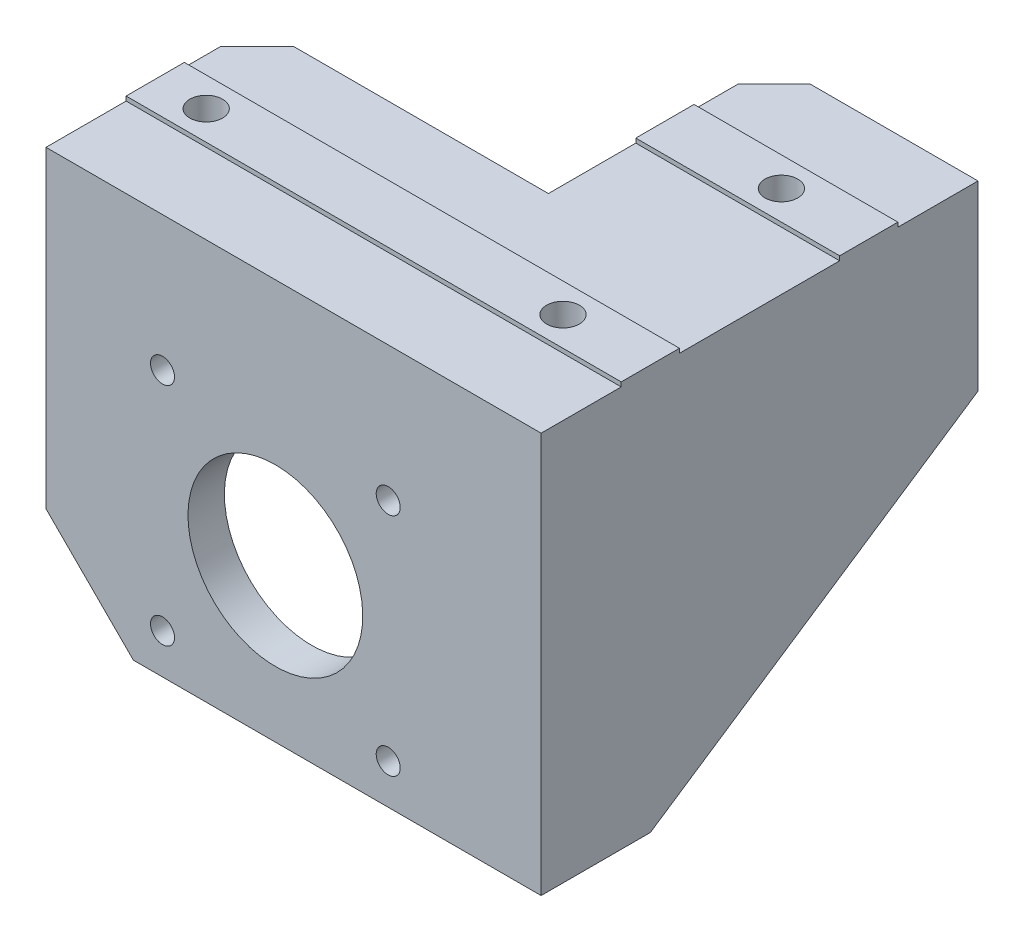
ISO-10303-21;
HEADER;
FILE_DESCRIPTION(('STEP AP214'),'2;1');
FILE_NAME('part.step','',(''),(''),'','','');
FILE_SCHEMA(('AUTOMOTIVE_DESIGN { 1 0 10303 214 1 1 1 1 }'));
ENDSEC;
DATA;
#1=APPLICATION_CONTEXT('core data for automotive mechanical design processes');
#2=APPLICATION_PROTOCOL_DEFINITION('international standard','automotive_design',2000,#1);
#3=PRODUCT_CONTEXT('',#1,'mechanical');
#4=PRODUCT('Part','Part','',(#3));
#5=PRODUCT_RELATED_PRODUCT_CATEGORY('part','',(#4));
#6=PRODUCT_DEFINITION_FORMATION('','',#4);
#7=PRODUCT_DEFINITION_CONTEXT('part definition',#1,'design');
#8=PRODUCT_DEFINITION('design','',#6,#7);
#9=PRODUCT_DEFINITION_SHAPE('','',#8);
#10=(LENGTH_UNIT() NAMED_UNIT(*) SI_UNIT(.MILLI.,.METRE.));
#11=(NAMED_UNIT(*) PLANE_ANGLE_UNIT() SI_UNIT($,.RADIAN.));
#12=(NAMED_UNIT(*) SI_UNIT($,.STERADIAN.) SOLID_ANGLE_UNIT());
#13=UNCERTAINTY_MEASURE_WITH_UNIT(LENGTH_MEASURE(1.E-05),#10,'distance_accuracy_value','');
#14=(GEOMETRIC_REPRESENTATION_CONTEXT(3) GLOBAL_UNCERTAINTY_ASSIGNED_CONTEXT((#13)) GLOBAL_UNIT_ASSIGNED_CONTEXT((#10,
#11,#12)) REPRESENTATION_CONTEXT('',''));
#15=CARTESIAN_POINT('',(0.,0.,0.));
#16=DIRECTION('',(0.,0.,1.));
#17=DIRECTION('',(1.,0.,0.));
#18=AXIS2_PLACEMENT_3D('',#15,#16,#17);
#19=CARTESIAN_POINT('',(31.5,12.,0.));
#20=DIRECTION('',(0.,-1.,0.));
#21=DIRECTION('',(0.,0.,-1.));
#22=AXIS2_PLACEMENT_3D('',#19,#20,#21);
#23=PLANE('',#22);
#24=DIRECTION('',(-1.,0.,0.));
#25=VECTOR('',#24,1.);
#26=CARTESIAN_POINT('',(31.5,12.,0.));
#27=LINE('',#26,#25);
#28=CARTESIAN_POINT('',(36.5,12.,0.));
#29=VERTEX_POINT('',#28);
#30=CARTESIAN_POINT('',(13.5,12.,0.));
#31=VERTEX_POINT('',#30);
#32=EDGE_CURVE('E471',#29,#31,#27,.T.);
#33=ORIENTED_EDGE('',*,*,#32,.T.);
#34=DIRECTION('',(0.707106781186548,0.,-0.707106781186547));
#35=VECTOR('',#34,1.);
#36=CARTESIAN_POINT('',(8.5,12.,4.99999999999998));
#37=LINE('',#36,#35);
#38=CARTESIAN_POINT('',(8.5,12.,4.99999999999998));
#39=VERTEX_POINT('',#38);
#40=EDGE_CURVE('E11',#31,#39,#37,.F.);
#41=ORIENTED_EDGE('',*,*,#40,.T.);
#42=DIRECTION('',(0.,0.,1.));
#43=VECTOR('',#42,1.);
#44=CARTESIAN_POINT('',(8.5,12.,0.));
#45=LINE('',#44,#43);
#46=CARTESIAN_POINT('',(8.5,12.,11.));
#47=VERTEX_POINT('',#46);
#48=EDGE_CURVE('E307',#39,#47,#45,.T.);
#49=ORIENTED_EDGE('',*,*,#48,.T.);
#50=DIRECTION('',(-1.,0.,0.));
#51=VECTOR('',#50,1.);
#52=CARTESIAN_POINT('',(36.5,12.,11.));
#53=LINE('',#52,#51);
#54=CARTESIAN_POINT('',(36.5,12.,11.));
#55=VERTEX_POINT('',#54);
#56=EDGE_CURVE('E431',#55,#47,#53,.T.);
#57=ORIENTED_EDGE('',*,*,#56,.F.);
#58=DIRECTION('',(0.,0.,1.));
#59=VECTOR('',#58,1.);
#60=CARTESIAN_POINT('',(36.5,12.,0.));
#61=LINE('',#60,#59);
#62=EDGE_CURVE('E202',#29,#55,#61,.T.);
#63=ORIENTED_EDGE('',*,*,#62,.F.);
#64=EDGE_LOOP('',(#33,#41,#49,#57,#63));
#65=FACE_BOUND('',#64,.T.);
#66=ADVANCED_FACE('F35',(#65),#23,.F.);
#67=DIRECTION('',(-1.,0.,0.));
#68=VECTOR('',#67,1.);
#69=CARTESIAN_POINT('',(-31.5,12.,31.));
#70=LINE('',#69,#68);
#71=CARTESIAN_POINT('',(8.5,12.,31.));
#72=VERTEX_POINT('',#71);
#73=CARTESIAN_POINT('',(-26.5,12.,31.));
#74=VERTEX_POINT('',#73);
#75=EDGE_CURVE('E322',#72,#74,#70,.T.);
#76=ORIENTED_EDGE('',*,*,#75,.T.);
#77=DIRECTION('',(-0.707106781186549,0.,0.707106781186547));
#78=VECTOR('',#77,1.);
#79=CARTESIAN_POINT('',(-31.5,12.,36.));
#80=LINE('',#79,#78);
#81=CARTESIAN_POINT('',(-31.5,12.,36.));
#82=VERTEX_POINT('',#81);
#83=EDGE_CURVE('E296',#74,#82,#80,.T.);
#84=ORIENTED_EDGE('',*,*,#83,.T.);
#85=DIRECTION('',(0.,0.,1.));
#86=VECTOR('',#85,1.);
#87=CARTESIAN_POINT('',(-31.5,12.,0.));
#88=LINE('',#87,#86);
#89=CARTESIAN_POINT('',(-31.5,12.,41.));
#90=VERTEX_POINT('',#89);
#91=EDGE_CURVE('E271',#82,#90,#88,.T.);
#92=ORIENTED_EDGE('',*,*,#91,.T.);
#93=DIRECTION('',(-1.,0.,0.));
#94=VECTOR('',#93,1.);
#95=CARTESIAN_POINT('',(-31.5,12.,41.));
#96=LINE('',#95,#94);
#97=CARTESIAN_POINT('',(36.5,12.,41.));
#98=VERTEX_POINT('',#97);
#99=EDGE_CURVE('E206',#98,#90,#96,.T.);
#100=ORIENTED_EDGE('',*,*,#99,.F.);
#101=CARTESIAN_POINT('',(36.5,12.,19.));
#102=VERTEX_POINT('',#101);
#103=EDGE_CURVE('E253',#102,#98,#61,.T.);
#104=ORIENTED_EDGE('',*,*,#103,.F.);
#105=DIRECTION('',(1.,0.,0.));
#106=VECTOR('',#105,1.);
#107=CARTESIAN_POINT('',(36.5,12.,19.));
#108=LINE('',#107,#106);
#109=CARTESIAN_POINT('',(8.5,12.,19.));
#110=VERTEX_POINT('',#109);
#111=EDGE_CURVE('E195',#110,#102,#108,.T.);
#112=ORIENTED_EDGE('',*,*,#111,.F.);
#113=EDGE_CURVE('E317',#110,#72,#45,.T.);
#114=ORIENTED_EDGE('',*,*,#113,.T.);
#115=EDGE_LOOP('',(#76,#84,#92,#100,#104,#112,#114));
#116=FACE_BOUND('',#115,.T.);
#117=ADVANCED_FACE('F443',(#116),#23,.F.);
#118=DIRECTION('',(1.,0.,0.));
#119=VECTOR('',#118,1.);
#120=CARTESIAN_POINT('',(-31.5,12.,49.));
#121=LINE('',#120,#119);
#122=CARTESIAN_POINT('',(-31.5,12.,49.));
#123=VERTEX_POINT('',#122);
#124=CARTESIAN_POINT('',(36.5,12.,49.));
#125=VERTEX_POINT('',#124);
#126=EDGE_CURVE('E203',#123,#125,#121,.T.);
#127=ORIENTED_EDGE('',*,*,#126,.F.);
#128=CARTESIAN_POINT('',(-31.5,12.,60.));
#129=VERTEX_POINT('',#128);
#130=EDGE_CURVE('E268',#123,#129,#88,.T.);
#131=ORIENTED_EDGE('',*,*,#130,.T.);
#132=DIRECTION('',(-1.,0.,0.));
#133=VECTOR('',#132,1.);
#134=CARTESIAN_POINT('',(31.5,12.,60.));
#135=LINE('',#134,#133);
#136=CARTESIAN_POINT('',(36.5,12.,60.));
#137=VERTEX_POINT('',#136);
#138=EDGE_CURVE('E385',#137,#129,#135,.T.);
#139=ORIENTED_EDGE('',*,*,#138,.F.);
#140=EDGE_CURVE('E228',#125,#137,#61,.T.);
#141=ORIENTED_EDGE('',*,*,#140,.F.);
#142=EDGE_LOOP('',(#127,#131,#139,#141));
#143=FACE_BOUND('',#142,.T.);
#144=ADVANCED_FACE('F484',(#143),#23,.F.);
#145=CARTESIAN_POINT('',(31.5,0.,55.));
#146=DIRECTION('',(0.,0.,1.));
#147=DIRECTION('',(0.,-1.,0.));
#148=AXIS2_PLACEMENT_3D('',#145,#146,#147);
#149=PLANE('',#148);
#150=CARTESIAN_POINT('',(-15.5,-6.5,55.));
#151=DIRECTION('',(0.,0.,-1.));
#152=DIRECTION('',(0.,1.,0.));
#153=AXIS2_PLACEMENT_3D('',#150,#151,#152);
#154=CIRCLE('',#153,1.65);
#155=CARTESIAN_POINT('',(-15.5,-4.85,55.));
#156=VERTEX_POINT('',#155);
#157=EDGE_CURVE('E327',#156,#156,#154,.T.);
#158=ORIENTED_EDGE('',*,*,#157,.F.);
#159=EDGE_LOOP('',(#158));
#160=FACE_BOUND('',#159,.T.);
#161=CARTESIAN_POINT('',(-15.5,-37.5,55.));
#162=DIRECTION('',(0.,0.,-1.));
#163=DIRECTION('',(0.,1.,0.));
#164=AXIS2_PLACEMENT_3D('',#161,#162,#163);
#165=CIRCLE('',#164,1.65);
#166=CARTESIAN_POINT('',(-15.5,-35.85,55.));
#167=VERTEX_POINT('',#166);
#168=EDGE_CURVE('E331',#167,#167,#165,.T.);
#169=ORIENTED_EDGE('',*,*,#168,.F.);
#170=EDGE_LOOP('',(#169));
#171=FACE_BOUND('',#170,.T.);
#172=CARTESIAN_POINT('',(15.5,-37.5,55.));
#173=DIRECTION('',(0.,0.,-1.));
#174=DIRECTION('',(0.,1.,0.));
#175=AXIS2_PLACEMENT_3D('',#172,#173,#174);
#176=CIRCLE('',#175,1.65);
#177=CARTESIAN_POINT('',(15.5,-35.85,55.));
#178=VERTEX_POINT('',#177);
#179=EDGE_CURVE('E337',#178,#178,#176,.T.);
#180=ORIENTED_EDGE('',*,*,#179,.F.);
#181=EDGE_LOOP('',(#180));
#182=FACE_BOUND('',#181,.T.);
#183=CARTESIAN_POINT('',(15.5,-6.5,55.));
#184=DIRECTION('',(0.,0.,-1.));
#185=DIRECTION('',(0.,1.,0.));
#186=AXIS2_PLACEMENT_3D('',#183,#184,#185);
#187=CIRCLE('',#186,1.65);
#188=CARTESIAN_POINT('',(15.5,-4.85,55.));
#189=VERTEX_POINT('',#188);
#190=EDGE_CURVE('E343',#189,#189,#187,.T.);
#191=ORIENTED_EDGE('',*,*,#190,.F.);
#192=EDGE_LOOP('',(#191));
#193=FACE_BOUND('',#192,.T.);
#194=CARTESIAN_POINT('',(0.,-22.,55.));
#195=DIRECTION('',(0.,0.,-1.));
#196=DIRECTION('',(0.,1.,0.));
#197=AXIS2_PLACEMENT_3D('',#194,#195,#196);
#198=CIRCLE('',#197,12.);
#199=CARTESIAN_POINT('',(0.,-10.,55.));
#200=VERTEX_POINT('',#199);
#201=EDGE_CURVE('E349',#200,#200,#198,.T.);
#202=ORIENTED_EDGE('',*,*,#201,.F.);
#203=EDGE_LOOP('',(#202));
#204=FACE_BOUND('',#203,.T.);
#205=DIRECTION('',(-1.,0.,0.));
#206=VECTOR('',#205,1.);
#207=CARTESIAN_POINT('',(31.5,-43.,55.));
#208=LINE('',#207,#206);
#209=CARTESIAN_POINT('',(31.5,-43.,55.));
#210=VERTEX_POINT('',#209);
#211=CARTESIAN_POINT('',(-19.5,-43.,55.));
#212=VERTEX_POINT('',#211);
#213=EDGE_CURVE('E364',#210,#212,#208,.T.);
#214=ORIENTED_EDGE('',*,*,#213,.T.);
#215=DIRECTION('',(-0.707106781186546,0.707106781186549,0.));
#216=VECTOR('',#215,1.);
#217=CARTESIAN_POINT('',(-19.5,-43.,55.));
#218=LINE('',#217,#216);
#219=CARTESIAN_POINT('',(-31.5,-31.,55.));
#220=VERTEX_POINT('',#219);
#221=EDGE_CURVE('E395',#212,#220,#218,.T.);
#222=ORIENTED_EDGE('',*,*,#221,.T.);
#223=DIRECTION('',(0.,1.,0.));
#224=VECTOR('',#223,1.);
#225=CARTESIAN_POINT('',(-31.5,0.,55.));
#226=LINE('',#225,#224);
#227=CARTESIAN_POINT('',(-31.5,0.,55.));
#228=VERTEX_POINT('',#227);
#229=EDGE_CURVE('E355',#220,#228,#226,.T.);
#230=ORIENTED_EDGE('',*,*,#229,.T.);
#231=DIRECTION('',(-1.,0.,0.));
#232=VECTOR('',#231,1.);
#233=CARTESIAN_POINT('',(31.5,0.,55.));
#234=LINE('',#233,#232);
#235=CARTESIAN_POINT('',(31.5,0.,55.));
#236=VERTEX_POINT('',#235);
#237=EDGE_CURVE('E400',#236,#228,#234,.T.);
#238=ORIENTED_EDGE('',*,*,#237,.F.);
#239=DIRECTION('',(0.,1.,0.));
#240=VECTOR('',#239,1.);
#241=CARTESIAN_POINT('',(31.5,0.,55.));
#242=LINE('',#241,#240);
#243=EDGE_CURVE('E365',#210,#236,#242,.T.);
#244=ORIENTED_EDGE('',*,*,#243,.F.);
#245=EDGE_LOOP('',(#214,#222,#230,#238,#244));
#246=FACE_BOUND('',#245,.T.);
#247=ADVANCED_FACE('F468',(#160,#171,#182,#193,#204,#246),#149,.F.);
#248=CARTESIAN_POINT('',(31.5,0.,55.));
#249=DIRECTION('',(0.,1.,0.));
#250=DIRECTION('',(0.,0.,1.));
#251=AXIS2_PLACEMENT_3D('',#248,#249,#250);
#252=PLANE('',#251);
#253=CARTESIAN_POINT('',(-24.5,0.,45.));
#254=DIRECTION('',(0.,-1.,0.));
#255=DIRECTION('',(0.,0.,-1.));
#256=AXIS2_PLACEMENT_3D('',#253,#254,#255);
#257=CIRCLE('',#256,5.);
#258=CARTESIAN_POINT('',(-24.5,0.,40.));
#259=VERTEX_POINT('',#258);
#260=EDGE_CURVE('E885',#259,#259,#257,.T.);
#261=ORIENTED_EDGE('',*,*,#260,.F.);
#262=EDGE_LOOP('',(#261));
#263=FACE_BOUND('',#262,.T.);
#264=CARTESIAN_POINT('',(24.5,0.,45.));
#265=DIRECTION('',(0.,-1.,0.));
#266=DIRECTION('',(0.,0.,-1.));
#267=AXIS2_PLACEMENT_3D('',#264,#265,#266);
#268=CIRCLE('',#267,5.);
#269=CARTESIAN_POINT('',(24.5,0.,40.));
#270=VERTEX_POINT('',#269);
#271=EDGE_CURVE('E403',#270,#270,#268,.T.);
#272=ORIENTED_EDGE('',*,*,#271,.F.);
#273=EDGE_LOOP('',(#272));
#274=FACE_BOUND('',#273,.T.);
#275=CARTESIAN_POINT('',(24.5,0.,15.));
#276=DIRECTION('',(0.,-1.,0.));
#277=DIRECTION('',(0.,0.,-1.));
#278=AXIS2_PLACEMENT_3D('',#275,#276,#277);
#279=CIRCLE('',#278,5.);
#280=CARTESIAN_POINT('',(24.5,0.,10.));
#281=VERTEX_POINT('',#280);
#282=EDGE_CURVE('E407',#281,#281,#279,.T.);
#283=ORIENTED_EDGE('',*,*,#282,.F.);
#284=EDGE_LOOP('',(#283));
#285=FACE_BOUND('',#284,.T.);
#286=DIRECTION('',(0.,0.,-1.));
#287=VECTOR('',#286,1.);
#288=CARTESIAN_POINT('',(-31.5,0.,55.));
#289=LINE('',#288,#287);
#290=CARTESIAN_POINT('',(-31.5,0.,36.));
#291=VERTEX_POINT('',#290);
#292=EDGE_CURVE('E272',#228,#291,#289,.T.);
#293=ORIENTED_EDGE('',*,*,#292,.T.);
#294=DIRECTION('',(0.707106781186549,0.,-0.707106781186547));
#295=VECTOR('',#294,1.);
#296=CARTESIAN_POINT('',(-31.5,0.,36.));
#297=LINE('',#296,#295);
#298=CARTESIAN_POINT('',(-26.5,0.,31.));
#299=VERTEX_POINT('',#298);
#300=EDGE_CURVE('E292',#291,#299,#297,.T.);
#301=ORIENTED_EDGE('',*,*,#300,.T.);
#302=DIRECTION('',(-1.,0.,0.));
#303=VECTOR('',#302,1.);
#304=CARTESIAN_POINT('',(-31.5,0.,31.));
#305=LINE('',#304,#303);
#306=CARTESIAN_POINT('',(8.5,0.,31.));
#307=VERTEX_POINT('',#306);
#308=EDGE_CURVE('E314',#307,#299,#305,.T.);
#309=ORIENTED_EDGE('',*,*,#308,.F.);
#310=DIRECTION('',(0.,0.,1.));
#311=VECTOR('',#310,1.);
#312=CARTESIAN_POINT('',(8.5,0.,0.));
#313=LINE('',#312,#311);
#314=CARTESIAN_POINT('',(8.5,0.,4.99999999999998));
#315=VERTEX_POINT('',#314);
#316=EDGE_CURVE('E305',#315,#307,#313,.T.);
#317=ORIENTED_EDGE('',*,*,#316,.F.);
#318=DIRECTION('',(-0.707106781186548,0.,0.707106781186547));
#319=VECTOR('',#318,1.);
#320=CARTESIAN_POINT('',(8.5,0.,4.99999999999998));
#321=LINE('',#320,#319);
#322=CARTESIAN_POINT('',(13.5,0.,0.));
#323=VERTEX_POINT('',#322);
#324=EDGE_CURVE('E290',#315,#323,#321,.F.);
#325=ORIENTED_EDGE('',*,*,#324,.T.);
#326=DIRECTION('',(-1.,0.,0.));
#327=VECTOR('',#326,1.);
#328=CARTESIAN_POINT('',(31.5,0.,0.));
#329=LINE('',#328,#327);
#330=CARTESIAN_POINT('',(31.5,0.,0.));
#331=VERTEX_POINT('',#330);
#332=EDGE_CURVE('E466',#331,#323,#329,.T.);
#333=ORIENTED_EDGE('',*,*,#332,.F.);
#334=DIRECTION('',(0.,0.,-1.));
#335=VECTOR('',#334,1.);
#336=CARTESIAN_POINT('',(31.5,0.,55.));
#337=LINE('',#336,#335);
#338=EDGE_CURVE('E360',#236,#331,#337,.T.);
#339=ORIENTED_EDGE('',*,*,#338,.F.);
#340=ORIENTED_EDGE('',*,*,#237,.T.);
#341=EDGE_LOOP('',(#293,#301,#309,#317,#325,#333,#339,#340));
#342=FACE_BOUND('',#341,.T.);
#343=ADVANCED_FACE('F312',(#263,#274,#285,#342),#252,.F.);
#344=CARTESIAN_POINT('',(31.5,0.,0.));
#345=DIRECTION('',(0.,0.,1.));
#346=DIRECTION('',(1.,0.,0.));
#347=AXIS2_PLACEMENT_3D('',#344,#345,#346);
#348=PLANE('',#347);
#349=ORIENTED_EDGE('',*,*,#332,.T.);
#350=DIRECTION('',(0.,1.,0.));
#351=VECTOR('',#350,1.);
#352=CARTESIAN_POINT('',(13.5,0.,0.));
#353=LINE('',#352,#351);
#354=EDGE_CURVE('E43',#323,#31,#353,.T.);
#355=ORIENTED_EDGE('',*,*,#354,.T.);
#356=ORIENTED_EDGE('',*,*,#32,.F.);
#357=DIRECTION('',(0.,1.,0.));
#358=VECTOR('',#357,1.);
#359=CARTESIAN_POINT('',(36.5,-13.,0.));
#360=LINE('',#359,#358);
#361=CARTESIAN_POINT('',(36.5,-13.,0.));
#362=VERTEX_POINT('',#361);
#363=EDGE_CURVE('E260',#362,#29,#360,.T.);
#364=ORIENTED_EDGE('',*,*,#363,.F.);
#365=DIRECTION('',(-1.,0.,0.));
#366=VECTOR('',#365,1.);
#367=CARTESIAN_POINT('',(36.5,-13.,0.));
#368=LINE('',#367,#366);
#369=CARTESIAN_POINT('',(31.5,-13.,0.));
#370=VERTEX_POINT('',#369);
#371=EDGE_CURVE('E267',#362,#370,#368,.T.);
#372=ORIENTED_EDGE('',*,*,#371,.T.);
#373=DIRECTION('',(0.,1.,0.));
#374=VECTOR('',#373,1.);
#375=CARTESIAN_POINT('',(31.5,-13.,0.));
#376=LINE('',#375,#374);
#377=EDGE_CURVE('E449',#370,#331,#376,.T.);
#378=ORIENTED_EDGE('',*,*,#377,.T.);
#379=EDGE_LOOP('',(#349,#355,#356,#364,#372,#378));
#380=FACE_BOUND('',#379,.T.);
#381=ADVANCED_FACE('F459',(#380),#348,.F.);
#382=CARTESIAN_POINT('',(31.5,-43.,60.));
#383=DIRECTION('',(0.,0.,-1.));
#384=DIRECTION('',(-1.,0.,0.));
#385=AXIS2_PLACEMENT_3D('',#382,#383,#384);
#386=PLANE('',#385);
#387=CARTESIAN_POINT('',(-15.5,-6.50000000000001,60.));
#388=DIRECTION('',(0.,0.,-1.));
#389=DIRECTION('',(0.,1.,0.));
#390=AXIS2_PLACEMENT_3D('',#387,#388,#389);
#391=CIRCLE('',#390,1.65);
#392=CARTESIAN_POINT('',(-15.5,-4.85,60.));
#393=VERTEX_POINT('',#392);
#394=EDGE_CURVE('E328',#393,#393,#391,.T.);
#395=ORIENTED_EDGE('',*,*,#394,.T.);
#396=EDGE_LOOP('',(#395));
#397=FACE_BOUND('',#396,.T.);
#398=CARTESIAN_POINT('',(-15.5,-37.5,60.));
#399=DIRECTION('',(0.,0.,-1.));
#400=DIRECTION('',(0.,1.,0.));
#401=AXIS2_PLACEMENT_3D('',#398,#399,#400);
#402=CIRCLE('',#401,1.65);
#403=CARTESIAN_POINT('',(-15.5,-35.85,60.));
#404=VERTEX_POINT('',#403);
#405=EDGE_CURVE('E334',#404,#404,#402,.T.);
#406=ORIENTED_EDGE('',*,*,#405,.T.);
#407=EDGE_LOOP('',(#406));
#408=FACE_BOUND('',#407,.T.);
#409=CARTESIAN_POINT('',(15.5,-37.5,60.));
#410=DIRECTION('',(0.,0.,-1.));
#411=DIRECTION('',(0.,1.,0.));
#412=AXIS2_PLACEMENT_3D('',#409,#410,#411);
#413=CIRCLE('',#412,1.65);
#414=CARTESIAN_POINT('',(15.5,-35.85,60.));
#415=VERTEX_POINT('',#414);
#416=EDGE_CURVE('E340',#415,#415,#413,.T.);
#417=ORIENTED_EDGE('',*,*,#416,.T.);
#418=EDGE_LOOP('',(#417));
#419=FACE_BOUND('',#418,.T.);
#420=CARTESIAN_POINT('',(15.5,-6.5,60.));
#421=DIRECTION('',(0.,0.,-1.));
#422=DIRECTION('',(0.,1.,0.));
#423=AXIS2_PLACEMENT_3D('',#420,#421,#422);
#424=CIRCLE('',#423,1.65);
#425=CARTESIAN_POINT('',(15.5,-4.85,60.));
#426=VERTEX_POINT('',#425);
#427=EDGE_CURVE('E346',#426,#426,#424,.T.);
#428=ORIENTED_EDGE('',*,*,#427,.T.);
#429=EDGE_LOOP('',(#428));
#430=FACE_BOUND('',#429,.T.);
#431=CARTESIAN_POINT('',(0.,-22.,60.));
#432=DIRECTION('',(0.,0.,-1.));
#433=DIRECTION('',(0.,1.,0.));
#434=AXIS2_PLACEMENT_3D('',#431,#432,#433);
#435=CIRCLE('',#434,12.);
#436=CARTESIAN_POINT('',(0.,-10.,60.));
#437=VERTEX_POINT('',#436);
#438=EDGE_CURVE('E352',#437,#437,#435,.T.);
#439=ORIENTED_EDGE('',*,*,#438,.T.);
#440=EDGE_LOOP('',(#439));
#441=FACE_BOUND('',#440,.T.);
#442=DIRECTION('',(0.,-1.,0.));
#443=VECTOR('',#442,1.);
#444=CARTESIAN_POINT('',(-31.5,-43.,60.));
#445=LINE('',#444,#443);
#446=CARTESIAN_POINT('',(-31.5,-31.,60.));
#447=VERTEX_POINT('',#446);
#448=EDGE_CURVE('E279',#129,#447,#445,.T.);
#449=ORIENTED_EDGE('',*,*,#448,.T.);
#450=DIRECTION('',(0.707106781186546,-0.707106781186549,0.));
#451=VECTOR('',#450,1.);
#452=CARTESIAN_POINT('',(-19.5,-43.,60.));
#453=LINE('',#452,#451);
#454=CARTESIAN_POINT('',(-19.5,-43.,60.));
#455=VERTEX_POINT('',#454);
#456=EDGE_CURVE('E285',#447,#455,#453,.T.);
#457=ORIENTED_EDGE('',*,*,#456,.T.);
#458=DIRECTION('',(-1.,0.,0.));
#459=VECTOR('',#458,1.);
#460=CARTESIAN_POINT('',(31.5,-43.,60.));
#461=LINE('',#460,#459);
#462=CARTESIAN_POINT('',(36.5,-43.,60.));
#463=VERTEX_POINT('',#462);
#464=EDGE_CURVE('E370',#463,#455,#461,.T.);
#465=ORIENTED_EDGE('',*,*,#464,.F.);
#466=DIRECTION('',(0.,-1.,0.));
#467=VECTOR('',#466,1.);
#468=CARTESIAN_POINT('',(36.5,12.,60.));
#469=LINE('',#468,#467);
#470=EDGE_CURVE('E452',#137,#463,#469,.T.);
#471=ORIENTED_EDGE('',*,*,#470,.F.);
#472=ORIENTED_EDGE('',*,*,#138,.T.);
#473=EDGE_LOOP('',(#449,#457,#465,#471,#472));
#474=FACE_BOUND('',#473,.T.);
#475=ADVANCED_FACE('F381',(#397,#408,#419,#430,#441,#474),#386,.F.);
#476=CARTESIAN_POINT('',(31.5,-43.,55.));
#477=DIRECTION('',(0.,1.,0.));
#478=DIRECTION('',(0.,0.,1.));
#479=AXIS2_PLACEMENT_3D('',#476,#477,#478);
#480=PLANE('',#479);
#481=ORIENTED_EDGE('',*,*,#464,.T.);
#482=DIRECTION('',(0.,0.,-1.));
#483=VECTOR('',#482,1.);
#484=CARTESIAN_POINT('',(-19.5,-43.,55.));
#485=LINE('',#484,#483);
#486=EDGE_CURVE('E394',#455,#212,#485,.T.);
#487=ORIENTED_EDGE('',*,*,#486,.T.);
#488=ORIENTED_EDGE('',*,*,#213,.F.);
#489=DIRECTION('',(0.,0.,-1.));
#490=VECTOR('',#489,1.);
#491=CARTESIAN_POINT('',(31.5,-43.,60.));
#492=LINE('',#491,#490);
#493=CARTESIAN_POINT('',(31.5,-43.,45.));
#494=VERTEX_POINT('',#493);
#495=EDGE_CURVE('E240',#210,#494,#492,.T.);
#496=ORIENTED_EDGE('',*,*,#495,.T.);
#497=DIRECTION('',(-1.,0.,0.));
#498=VECTOR('',#497,1.);
#499=CARTESIAN_POINT('',(36.5,-43.,45.));
#500=LINE('',#499,#498);
#501=CARTESIAN_POINT('',(36.5,-43.,45.));
#502=VERTEX_POINT('',#501);
#503=EDGE_CURVE('E315',#502,#494,#500,.T.);
#504=ORIENTED_EDGE('',*,*,#503,.F.);
#505=DIRECTION('',(0.,0.,-1.));
#506=VECTOR('',#505,1.);
#507=CARTESIAN_POINT('',(36.5,-43.,60.));
#508=LINE('',#507,#506);
#509=EDGE_CURVE('E478',#463,#502,#508,.T.);
#510=ORIENTED_EDGE('',*,*,#509,.F.);
#511=EDGE_LOOP('',(#481,#487,#488,#496,#504,#510));
#512=FACE_BOUND('',#511,.T.);
#513=ADVANCED_FACE('F476',(#512),#480,.F.);
#514=CARTESIAN_POINT('',(-31.5,0.,0.));
#515=DIRECTION('',(-1.,0.,0.));
#516=DIRECTION('',(0.,0.,1.));
#517=AXIS2_PLACEMENT_3D('',#514,#515,#516);
#518=PLANE('',#517);
#519=ORIENTED_EDGE('',*,*,#91,.F.);
#520=DIRECTION('',(0.,-1.,0.));
#521=VECTOR('',#520,1.);
#522=CARTESIAN_POINT('',(-31.5,0.,36.));
#523=LINE('',#522,#521);
#524=EDGE_CURVE('E287',#82,#291,#523,.T.);
#525=ORIENTED_EDGE('',*,*,#524,.T.);
#526=ORIENTED_EDGE('',*,*,#292,.F.);
#527=ORIENTED_EDGE('',*,*,#229,.F.);
#528=DIRECTION('',(0.,0.,1.));
#529=VECTOR('',#528,1.);
#530=CARTESIAN_POINT('',(-31.5,-31.,60.));
#531=LINE('',#530,#529);
#532=EDGE_CURVE('E392',#220,#447,#531,.T.);
#533=ORIENTED_EDGE('',*,*,#532,.T.);
#534=ORIENTED_EDGE('',*,*,#448,.F.);
#535=ORIENTED_EDGE('',*,*,#130,.F.);
#536=DIRECTION('',(0.,-1.,0.));
#537=VECTOR('',#536,1.);
#538=CARTESIAN_POINT('',(-31.5,12.6,49.));
#539=LINE('',#538,#537);
#540=CARTESIAN_POINT('',(-31.5,12.6,49.));
#541=VERTEX_POINT('',#540);
#542=EDGE_CURVE('E234',#541,#123,#539,.T.);
#543=ORIENTED_EDGE('',*,*,#542,.F.);
#544=DIRECTION('',(0.,0.,1.));
#545=VECTOR('',#544,1.);
#546=CARTESIAN_POINT('',(-31.5,12.6,41.));
#547=LINE('',#546,#545);
#548=CARTESIAN_POINT('',(-31.5,12.6,41.));
#549=VERTEX_POINT('',#548);
#550=EDGE_CURVE('E212',#549,#541,#547,.T.);
#551=ORIENTED_EDGE('',*,*,#550,.F.);
#552=DIRECTION('',(0.,-1.,0.));
#553=VECTOR('',#552,1.);
#554=CARTESIAN_POINT('',(-31.5,12.6,41.));
#555=LINE('',#554,#553);
#556=EDGE_CURVE('E221',#549,#90,#555,.T.);
#557=ORIENTED_EDGE('',*,*,#556,.T.);
#558=EDGE_LOOP('',(#519,#525,#526,#527,#533,#534,#535,#543,#551,#557));
#559=FACE_BOUND('',#558,.T.);
#560=ADVANCED_FACE('F487',(#559),#518,.T.);
#561=CARTESIAN_POINT('',(0.,-22.,60.));
#562=DIRECTION('',(0.,0.,-1.));
#563=DIRECTION('',(0.,1.,0.));
#564=AXIS2_PLACEMENT_3D('',#561,#562,#563);
#565=CYLINDRICAL_SURFACE('',#564,12.);
#566=ORIENTED_EDGE('',*,*,#438,.F.);
#567=EDGE_LOOP('',(#566));
#568=FACE_BOUND('',#567,.T.);
#569=ORIENTED_EDGE('',*,*,#201,.T.);
#570=EDGE_LOOP('',(#569));
#571=FACE_BOUND('',#570,.T.);
#572=ADVANCED_FACE('F574',(#568,#571),#565,.F.);
#573=CARTESIAN_POINT('',(15.5,-6.5,60.));
#574=DIRECTION('',(0.,0.,-1.));
#575=DIRECTION('',(0.,1.,0.));
#576=AXIS2_PLACEMENT_3D('',#573,#574,#575);
#577=CYLINDRICAL_SURFACE('',#576,1.65);
#578=ORIENTED_EDGE('',*,*,#427,.F.);
#579=EDGE_LOOP('',(#578));
#580=FACE_BOUND('',#579,.T.);
#581=ORIENTED_EDGE('',*,*,#190,.T.);
#582=EDGE_LOOP('',(#581));
#583=FACE_BOUND('',#582,.T.);
#584=ADVANCED_FACE('F820',(#580,#583),#577,.F.);
#585=CARTESIAN_POINT('',(15.5,-37.5,60.));
#586=DIRECTION('',(0.,0.,-1.));
#587=DIRECTION('',(0.,1.,0.));
#588=AXIS2_PLACEMENT_3D('',#585,#586,#587);
#589=CYLINDRICAL_SURFACE('',#588,1.65);
#590=ORIENTED_EDGE('',*,*,#416,.F.);
#591=EDGE_LOOP('',(#590));
#592=FACE_BOUND('',#591,.T.);
#593=ORIENTED_EDGE('',*,*,#179,.T.);
#594=EDGE_LOOP('',(#593));
#595=FACE_BOUND('',#594,.T.);
#596=ADVANCED_FACE('F810',(#592,#595),#589,.F.);
#597=CARTESIAN_POINT('',(-15.5,-37.5,60.));
#598=DIRECTION('',(0.,0.,-1.));
#599=DIRECTION('',(0.,1.,0.));
#600=AXIS2_PLACEMENT_3D('',#597,#598,#599);
#601=CYLINDRICAL_SURFACE('',#600,1.65);
#602=ORIENTED_EDGE('',*,*,#405,.F.);
#603=EDGE_LOOP('',(#602));
#604=FACE_BOUND('',#603,.T.);
#605=ORIENTED_EDGE('',*,*,#168,.T.);
#606=EDGE_LOOP('',(#605));
#607=FACE_BOUND('',#606,.T.);
#608=ADVANCED_FACE('F513',(#604,#607),#601,.F.);
#609=CARTESIAN_POINT('',(-15.5,-6.50000000000001,60.));
#610=DIRECTION('',(0.,0.,-1.));
#611=DIRECTION('',(0.,1.,0.));
#612=AXIS2_PLACEMENT_3D('',#609,#610,#611);
#613=CYLINDRICAL_SURFACE('',#612,1.65);
#614=ORIENTED_EDGE('',*,*,#394,.F.);
#615=EDGE_LOOP('',(#614));
#616=FACE_BOUND('',#615,.T.);
#617=ORIENTED_EDGE('',*,*,#157,.T.);
#618=EDGE_LOOP('',(#617));
#619=FACE_BOUND('',#618,.T.);
#620=ADVANCED_FACE('F506',(#616,#619),#613,.F.);
#621=CARTESIAN_POINT('',(-31.5,12.,31.));
#622=DIRECTION('',(0.,0.,1.));
#623=DIRECTION('',(1.,0.,0.));
#624=AXIS2_PLACEMENT_3D('',#621,#622,#623);
#625=PLANE('',#624);
#626=ORIENTED_EDGE('',*,*,#308,.T.);
#627=DIRECTION('',(0.,1.,0.));
#628=VECTOR('',#627,1.);
#629=CARTESIAN_POINT('',(-26.5,12.,31.));
#630=LINE('',#629,#628);
#631=EDGE_CURVE('E294',#299,#74,#630,.T.);
#632=ORIENTED_EDGE('',*,*,#631,.T.);
#633=ORIENTED_EDGE('',*,*,#75,.F.);
#634=DIRECTION('',(0.,-1.,0.));
#635=VECTOR('',#634,1.);
#636=CARTESIAN_POINT('',(8.5,12.,31.));
#637=LINE('',#636,#635);
#638=EDGE_CURVE('E325',#72,#307,#637,.T.);
#639=ORIENTED_EDGE('',*,*,#638,.T.);
#640=EDGE_LOOP('',(#626,#632,#633,#639));
#641=FACE_BOUND('',#640,.T.);
#642=ADVANCED_FACE('F504',(#641),#625,.F.);
#643=CARTESIAN_POINT('',(8.5,12.,0.));
#644=DIRECTION('',(1.,0.,0.));
#645=DIRECTION('',(0.,0.,-1.));
#646=AXIS2_PLACEMENT_3D('',#643,#644,#645);
#647=PLANE('',#646);
#648=ORIENTED_EDGE('',*,*,#48,.F.);
#649=DIRECTION('',(0.,-1.,0.));
#650=VECTOR('',#649,1.);
#651=CARTESIAN_POINT('',(8.5,12.,4.99999999999998));
#652=LINE('',#651,#650);
#653=EDGE_CURVE('E298',#39,#315,#652,.T.);
#654=ORIENTED_EDGE('',*,*,#653,.T.);
#655=ORIENTED_EDGE('',*,*,#316,.T.);
#656=ORIENTED_EDGE('',*,*,#638,.F.);
#657=ORIENTED_EDGE('',*,*,#113,.F.);
#658=DIRECTION('',(0.,-1.,0.));
#659=VECTOR('',#658,1.);
#660=CARTESIAN_POINT('',(8.5,12.6,19.));
#661=LINE('',#660,#659);
#662=CARTESIAN_POINT('',(8.5,12.6,19.));
#663=VERTEX_POINT('',#662);
#664=EDGE_CURVE('E208',#663,#110,#661,.T.);
#665=ORIENTED_EDGE('',*,*,#664,.F.);
#666=DIRECTION('',(0.,0.,1.));
#667=VECTOR('',#666,1.);
#668=CARTESIAN_POINT('',(8.5,12.6,11.));
#669=LINE('',#668,#667);
#670=CARTESIAN_POINT('',(8.5,12.6,11.));
#671=VERTEX_POINT('',#670);
#672=EDGE_CURVE('E186',#671,#663,#669,.T.);
#673=ORIENTED_EDGE('',*,*,#672,.F.);
#674=DIRECTION('',(0.,-1.,0.));
#675=VECTOR('',#674,1.);
#676=CARTESIAN_POINT('',(8.5,12.6,11.));
#677=LINE('',#676,#675);
#678=EDGE_CURVE('E183',#671,#47,#677,.T.);
#679=ORIENTED_EDGE('',*,*,#678,.T.);
#680=EDGE_LOOP('',(#648,#654,#655,#656,#657,#665,#673,#679));
#681=FACE_BOUND('',#680,.T.);
#682=ADVANCED_FACE('F303',(#681),#647,.F.);
#683=CARTESIAN_POINT('',(31.5,0.,0.));
#684=DIRECTION('',(1.,0.,0.));
#685=DIRECTION('',(0.,0.,-1.));
#686=AXIS2_PLACEMENT_3D('',#683,#684,#685);
#687=PLANE('',#686);
#688=ORIENTED_EDGE('',*,*,#495,.F.);
#689=ORIENTED_EDGE('',*,*,#243,.T.);
#690=ORIENTED_EDGE('',*,*,#338,.T.);
#691=ORIENTED_EDGE('',*,*,#377,.F.);
#692=DIRECTION('',(0.,0.554700196225229,-0.832050294337844));
#693=VECTOR('',#692,1.);
#694=CARTESIAN_POINT('',(31.5,-43.,45.));
#695=LINE('',#694,#693);
#696=EDGE_CURVE('E448',#494,#370,#695,.T.);
#697=ORIENTED_EDGE('',*,*,#696,.F.);
#698=EDGE_LOOP('',(#688,#689,#690,#691,#697));
#699=FACE_BOUND('',#698,.T.);
#700=ADVANCED_FACE('F463',(#699),#687,.F.);
#701=CARTESIAN_POINT('',(36.5,-43.,45.));
#702=DIRECTION('',(0.,0.832050294337844,0.554700196225229));
#703=DIRECTION('',(0.,-0.554700196225229,0.832050294337844));
#704=AXIS2_PLACEMENT_3D('',#701,#702,#703);
#705=PLANE('',#704);
#706=ORIENTED_EDGE('',*,*,#696,.T.);
#707=ORIENTED_EDGE('',*,*,#371,.F.);
#708=DIRECTION('',(0.,0.554700196225229,-0.832050294337844));
#709=VECTOR('',#708,1.);
#710=CARTESIAN_POINT('',(36.5,-43.,45.));
#711=LINE('',#710,#709);
#712=EDGE_CURVE('E479',#502,#362,#711,.T.);
#713=ORIENTED_EDGE('',*,*,#712,.F.);
#714=ORIENTED_EDGE('',*,*,#503,.T.);
#715=EDGE_LOOP('',(#706,#707,#713,#714));
#716=FACE_BOUND('',#715,.T.);
#717=ADVANCED_FACE('F776',(#716),#705,.F.);
#718=CARTESIAN_POINT('',(36.5,0.,0.));
#719=DIRECTION('',(1.,0.,0.));
#720=DIRECTION('',(0.,0.,-1.));
#721=AXIS2_PLACEMENT_3D('',#718,#719,#720);
#722=PLANE('',#721);
#723=ORIENTED_EDGE('',*,*,#470,.T.);
#724=ORIENTED_EDGE('',*,*,#509,.T.);
#725=ORIENTED_EDGE('',*,*,#712,.T.);
#726=ORIENTED_EDGE('',*,*,#363,.T.);
#727=ORIENTED_EDGE('',*,*,#62,.T.);
#728=DIRECTION('',(0.,-1.,0.));
#729=VECTOR('',#728,1.);
#730=CARTESIAN_POINT('',(36.5,12.6,11.));
#731=LINE('',#730,#729);
#732=CARTESIAN_POINT('',(36.5,12.6,11.));
#733=VERTEX_POINT('',#732);
#734=EDGE_CURVE('E180',#733,#55,#731,.T.);
#735=ORIENTED_EDGE('',*,*,#734,.F.);
#736=DIRECTION('',(0.,0.,-1.));
#737=VECTOR('',#736,1.);
#738=CARTESIAN_POINT('',(36.5,12.6,11.));
#739=LINE('',#738,#737);
#740=CARTESIAN_POINT('',(36.5,12.6,19.));
#741=VERTEX_POINT('',#740);
#742=EDGE_CURVE('E187',#741,#733,#739,.T.);
#743=ORIENTED_EDGE('',*,*,#742,.F.);
#744=DIRECTION('',(0.,-1.,0.));
#745=VECTOR('',#744,1.);
#746=CARTESIAN_POINT('',(36.5,12.6,19.));
#747=LINE('',#746,#745);
#748=EDGE_CURVE('E430',#741,#102,#747,.T.);
#749=ORIENTED_EDGE('',*,*,#748,.T.);
#750=ORIENTED_EDGE('',*,*,#103,.T.);
#751=DIRECTION('',(0.,-1.,0.));
#752=VECTOR('',#751,1.);
#753=CARTESIAN_POINT('',(36.5,12.6,41.));
#754=LINE('',#753,#752);
#755=CARTESIAN_POINT('',(36.5,12.6,41.));
#756=VERTEX_POINT('',#755);
#757=EDGE_CURVE('E235',#756,#98,#754,.T.);
#758=ORIENTED_EDGE('',*,*,#757,.F.);
#759=DIRECTION('',(0.,0.,-1.));
#760=VECTOR('',#759,1.);
#761=CARTESIAN_POINT('',(36.5,12.6,41.));
#762=LINE('',#761,#760);
#763=CARTESIAN_POINT('',(36.5,12.6,49.));
#764=VERTEX_POINT('',#763);
#765=EDGE_CURVE('E217',#764,#756,#762,.T.);
#766=ORIENTED_EDGE('',*,*,#765,.F.);
#767=DIRECTION('',(0.,-1.,0.));
#768=VECTOR('',#767,1.);
#769=CARTESIAN_POINT('',(36.5,12.6,49.));
#770=LINE('',#769,#768);
#771=EDGE_CURVE('E231',#764,#125,#770,.T.);
#772=ORIENTED_EDGE('',*,*,#771,.T.);
#773=ORIENTED_EDGE('',*,*,#140,.T.);
#774=EDGE_LOOP('',(#723,#724,#725,#726,#727,#735,#743,#749,#750,#758,#766,#772,#773));
#775=FACE_BOUND('',#774,.T.);
#776=ADVANCED_FACE('F199',(#775),#722,.T.);
#777=CARTESIAN_POINT('',(-31.5,12.6,49.));
#778=DIRECTION('',(0.,0.,-1.));
#779=DIRECTION('',(0.,1.,0.));
#780=AXIS2_PLACEMENT_3D('',#777,#778,#779);
#781=PLANE('',#780);
#782=ORIENTED_EDGE('',*,*,#126,.T.);
#783=ORIENTED_EDGE('',*,*,#771,.F.);
#784=DIRECTION('',(1.,0.,0.));
#785=VECTOR('',#784,1.);
#786=CARTESIAN_POINT('',(-31.5,12.6,49.));
#787=LINE('',#786,#785);
#788=EDGE_CURVE('E215',#541,#764,#787,.T.);
#789=ORIENTED_EDGE('',*,*,#788,.F.);
#790=ORIENTED_EDGE('',*,*,#542,.T.);
#791=EDGE_LOOP('',(#782,#783,#789,#790));
#792=FACE_BOUND('',#791,.T.);
#793=ADVANCED_FACE('F490',(#792),#781,.F.);
#794=CARTESIAN_POINT('',(-31.5,12.6,41.));
#795=DIRECTION('',(0.,0.,1.));
#796=DIRECTION('',(1.,0.,0.));
#797=AXIS2_PLACEMENT_3D('',#794,#795,#796);
#798=PLANE('',#797);
#799=ORIENTED_EDGE('',*,*,#99,.T.);
#800=ORIENTED_EDGE('',*,*,#556,.F.);
#801=DIRECTION('',(-1.,0.,0.));
#802=VECTOR('',#801,1.);
#803=CARTESIAN_POINT('',(-31.5,12.6,41.));
#804=LINE('',#803,#802);
#805=EDGE_CURVE('E219',#756,#549,#804,.T.);
#806=ORIENTED_EDGE('',*,*,#805,.F.);
#807=ORIENTED_EDGE('',*,*,#757,.T.);
#808=EDGE_LOOP('',(#799,#800,#806,#807));
#809=FACE_BOUND('',#808,.T.);
#810=ADVANCED_FACE('F497',(#809),#798,.F.);
#811=CARTESIAN_POINT('',(0.,12.6,0.));
#812=DIRECTION('',(0.,1.,0.));
#813=DIRECTION('',(0.,0.,1.));
#814=AXIS2_PLACEMENT_3D('',#811,#812,#813);
#815=PLANE('',#814);
#816=CARTESIAN_POINT('',(-24.5,12.6,45.));
#817=DIRECTION('',(0.,1.,0.));
#818=DIRECTION('',(0.,0.,1.));
#819=AXIS2_PLACEMENT_3D('',#816,#817,#818);
#820=CIRCLE('',#819,2.25);
#821=CARTESIAN_POINT('',(-24.5,12.6,47.25));
#822=VERTEX_POINT('',#821);
#823=EDGE_CURVE('E401',#822,#822,#820,.T.);
#824=ORIENTED_EDGE('',*,*,#823,.F.);
#825=EDGE_LOOP('',(#824));
#826=FACE_BOUND('',#825,.T.);
#827=CARTESIAN_POINT('',(24.5,12.6,45.));
#828=DIRECTION('',(0.,1.,0.));
#829=DIRECTION('',(0.,0.,1.));
#830=AXIS2_PLACEMENT_3D('',#827,#828,#829);
#831=CIRCLE('',#830,2.25);
#832=CARTESIAN_POINT('',(24.5,12.6,47.25));
#833=VERTEX_POINT('',#832);
#834=EDGE_CURVE('E405',#833,#833,#831,.T.);
#835=ORIENTED_EDGE('',*,*,#834,.F.);
#836=EDGE_LOOP('',(#835));
#837=FACE_BOUND('',#836,.T.);
#838=ORIENTED_EDGE('',*,*,#550,.T.);
#839=ORIENTED_EDGE('',*,*,#788,.T.);
#840=ORIENTED_EDGE('',*,*,#765,.T.);
#841=ORIENTED_EDGE('',*,*,#805,.T.);
#842=EDGE_LOOP('',(#838,#839,#840,#841));
#843=FACE_BOUND('',#842,.T.);
#844=ADVANCED_FACE('F492',(#826,#837,#843),#815,.T.);
#845=CARTESIAN_POINT('',(36.5,12.6,11.));
#846=DIRECTION('',(0.,0.,1.));
#847=DIRECTION('',(1.,0.,0.));
#848=AXIS2_PLACEMENT_3D('',#845,#846,#847);
#849=PLANE('',#848);
#850=ORIENTED_EDGE('',*,*,#56,.T.);
#851=ORIENTED_EDGE('',*,*,#678,.F.);
#852=DIRECTION('',(-1.,0.,0.));
#853=VECTOR('',#852,1.);
#854=CARTESIAN_POINT('',(36.5,12.6,11.));
#855=LINE('',#854,#853);
#856=EDGE_CURVE('E175',#733,#671,#855,.T.);
#857=ORIENTED_EDGE('',*,*,#856,.F.);
#858=ORIENTED_EDGE('',*,*,#734,.T.);
#859=EDGE_LOOP('',(#850,#851,#857,#858));
#860=FACE_BOUND('',#859,.T.);
#861=ADVANCED_FACE('F178',(#860),#849,.F.);
#862=CARTESIAN_POINT('',(36.5,12.6,19.));
#863=DIRECTION('',(0.,0.,-1.));
#864=DIRECTION('',(-1.,0.,0.));
#865=AXIS2_PLACEMENT_3D('',#862,#863,#864);
#866=PLANE('',#865);
#867=ORIENTED_EDGE('',*,*,#111,.T.);
#868=ORIENTED_EDGE('',*,*,#748,.F.);
#869=DIRECTION('',(1.,0.,0.));
#870=VECTOR('',#869,1.);
#871=CARTESIAN_POINT('',(36.5,12.6,19.));
#872=LINE('',#871,#870);
#873=EDGE_CURVE('E192',#663,#741,#872,.T.);
#874=ORIENTED_EDGE('',*,*,#873,.F.);
#875=ORIENTED_EDGE('',*,*,#664,.T.);
#876=EDGE_LOOP('',(#867,#868,#874,#875));
#877=FACE_BOUND('',#876,.T.);
#878=ADVANCED_FACE('F438',(#877),#866,.F.);
#879=CARTESIAN_POINT('',(0.,12.6,0.));
#880=DIRECTION('',(0.,-1.,0.));
#881=DIRECTION('',(0.,0.,-1.));
#882=AXIS2_PLACEMENT_3D('',#879,#880,#881);
#883=PLANE('',#882);
#884=CARTESIAN_POINT('',(24.5,12.6,15.));
#885=DIRECTION('',(0.,-1.,0.));
#886=DIRECTION('',(0.,0.,-1.));
#887=AXIS2_PLACEMENT_3D('',#884,#885,#886);
#888=CIRCLE('',#887,2.25);
#889=CARTESIAN_POINT('',(24.5,12.6,12.75));
#890=VERTEX_POINT('',#889);
#891=EDGE_CURVE('E255',#890,#890,#888,.T.);
#892=ORIENTED_EDGE('',*,*,#891,.T.);
#893=EDGE_LOOP('',(#892));
#894=FACE_BOUND('',#893,.T.);
#895=ORIENTED_EDGE('',*,*,#742,.T.);
#896=ORIENTED_EDGE('',*,*,#856,.T.);
#897=ORIENTED_EDGE('',*,*,#672,.T.);
#898=ORIENTED_EDGE('',*,*,#873,.T.);
#899=EDGE_LOOP('',(#895,#896,#897,#898));
#900=FACE_BOUND('',#899,.T.);
#901=ADVANCED_FACE('F190',(#894,#900),#883,.F.);
#902=CARTESIAN_POINT('',(24.5,0.,15.));
#903=DIRECTION('',(0.,-1.,0.));
#904=DIRECTION('',(0.,0.,-1.));
#905=AXIS2_PLACEMENT_3D('',#902,#903,#904);
#906=CYLINDRICAL_SURFACE('',#905,2.25);
#907=CARTESIAN_POINT('',(24.5,8.,15.));
#908=DIRECTION('',(0.,-1.,0.));
#909=DIRECTION('',(0.,0.,-1.));
#910=AXIS2_PLACEMENT_3D('',#907,#908,#909);
#911=CIRCLE('',#910,2.25);
#912=CARTESIAN_POINT('',(24.5,8.,12.75));
#913=VERTEX_POINT('',#912);
#914=EDGE_CURVE('E425',#913,#913,#911,.T.);
#915=ORIENTED_EDGE('',*,*,#914,.T.);
#916=EDGE_LOOP('',(#915));
#917=FACE_BOUND('',#916,.T.);
#918=ORIENTED_EDGE('',*,*,#891,.F.);
#919=EDGE_LOOP('',(#918));
#920=FACE_BOUND('',#919,.T.);
#921=ADVANCED_FACE('F708',(#917,#920),#906,.F.);
#922=CARTESIAN_POINT('',(26.75,8.,15.));
#923=DIRECTION('',(0.,1.,0.));
#924=DIRECTION('',(0.,0.,1.));
#925=AXIS2_PLACEMENT_3D('',#922,#923,#924);
#926=PLANE('',#925);
#927=ORIENTED_EDGE('',*,*,#914,.F.);
#928=EDGE_LOOP('',(#927));
#929=FACE_BOUND('',#928,.T.);
#930=CARTESIAN_POINT('',(24.5,8.,15.));
#931=DIRECTION('',(0.,-1.,0.));
#932=DIRECTION('',(0.,0.,-1.));
#933=AXIS2_PLACEMENT_3D('',#930,#931,#932);
#934=CIRCLE('',#933,5.);
#935=CARTESIAN_POINT('',(24.5,8.,10.));
#936=VERTEX_POINT('',#935);
#937=EDGE_CURVE('E412',#936,#936,#934,.T.);
#938=ORIENTED_EDGE('',*,*,#937,.T.);
#939=EDGE_LOOP('',(#938));
#940=FACE_BOUND('',#939,.T.);
#941=ADVANCED_FACE('F698',(#929,#940),#926,.F.);
#942=CARTESIAN_POINT('',(24.5,0.,15.));
#943=DIRECTION('',(0.,-1.,0.));
#944=DIRECTION('',(0.,0.,-1.));
#945=AXIS2_PLACEMENT_3D('',#942,#943,#944);
#946=CYLINDRICAL_SURFACE('',#945,5.);
#947=ORIENTED_EDGE('',*,*,#937,.F.);
#948=EDGE_LOOP('',(#947));
#949=FACE_BOUND('',#948,.T.);
#950=ORIENTED_EDGE('',*,*,#282,.T.);
#951=EDGE_LOOP('',(#950));
#952=FACE_BOUND('',#951,.T.);
#953=ADVANCED_FACE('F689',(#949,#952),#946,.F.);
#954=CARTESIAN_POINT('',(24.5,0.,45.));
#955=DIRECTION('',(0.,-1.,0.));
#956=DIRECTION('',(0.,0.,-1.));
#957=AXIS2_PLACEMENT_3D('',#954,#955,#956);
#958=CYLINDRICAL_SURFACE('',#957,2.25);
#959=ORIENTED_EDGE('',*,*,#834,.T.);
#960=EDGE_LOOP('',(#959));
#961=FACE_BOUND('',#960,.T.);
#962=CARTESIAN_POINT('',(24.5,8.,45.));
#963=DIRECTION('',(0.,-1.,0.));
#964=DIRECTION('',(0.,0.,-1.));
#965=AXIS2_PLACEMENT_3D('',#962,#963,#964);
#966=CIRCLE('',#965,2.25);
#967=CARTESIAN_POINT('',(24.5,8.,42.75));
#968=VERTEX_POINT('',#967);
#969=EDGE_CURVE('E408',#968,#968,#966,.T.);
#970=ORIENTED_EDGE('',*,*,#969,.T.);
#971=EDGE_LOOP('',(#970));
#972=FACE_BOUND('',#971,.T.);
#973=ADVANCED_FACE('F679',(#961,#972),#958,.F.);
#974=CARTESIAN_POINT('',(26.75,8.,45.));
#975=DIRECTION('',(0.,1.,0.));
#976=DIRECTION('',(0.,0.,1.));
#977=AXIS2_PLACEMENT_3D('',#974,#975,#976);
#978=PLANE('',#977);
#979=ORIENTED_EDGE('',*,*,#969,.F.);
#980=EDGE_LOOP('',(#979));
#981=FACE_BOUND('',#980,.T.);
#982=CARTESIAN_POINT('',(24.5,8.,45.));
#983=DIRECTION('',(0.,-1.,0.));
#984=DIRECTION('',(0.,0.,-1.));
#985=AXIS2_PLACEMENT_3D('',#982,#983,#984);
#986=CIRCLE('',#985,5.);
#987=CARTESIAN_POINT('',(24.5,8.,40.));
#988=VERTEX_POINT('',#987);
#989=EDGE_CURVE('E415',#988,#988,#986,.T.);
#990=ORIENTED_EDGE('',*,*,#989,.T.);
#991=EDGE_LOOP('',(#990));
#992=FACE_BOUND('',#991,.T.);
#993=ADVANCED_FACE('F669',(#981,#992),#978,.F.);
#994=CARTESIAN_POINT('',(24.5,0.,45.));
#995=DIRECTION('',(0.,-1.,0.));
#996=DIRECTION('',(0.,0.,-1.));
#997=AXIS2_PLACEMENT_3D('',#994,#995,#996);
#998=CYLINDRICAL_SURFACE('',#997,5.);
#999=ORIENTED_EDGE('',*,*,#989,.F.);
#1000=EDGE_LOOP('',(#999));
#1001=FACE_BOUND('',#1000,.T.);
#1002=ORIENTED_EDGE('',*,*,#271,.T.);
#1003=EDGE_LOOP('',(#1002));
#1004=FACE_BOUND('',#1003,.T.);
#1005=ADVANCED_FACE('F659',(#1001,#1004),#998,.F.);
#1006=CARTESIAN_POINT('',(-24.5,0.,45.));
#1007=DIRECTION('',(0.,-1.,0.));
#1008=DIRECTION('',(0.,0.,-1.));
#1009=AXIS2_PLACEMENT_3D('',#1006,#1007,#1008);
#1010=CYLINDRICAL_SURFACE('',#1009,2.25);
#1011=ORIENTED_EDGE('',*,*,#823,.T.);
#1012=EDGE_LOOP('',(#1011));
#1013=FACE_BOUND('',#1012,.T.);
#1014=CARTESIAN_POINT('',(-24.5,8.,45.));
#1015=DIRECTION('',(0.,-1.,0.));
#1016=DIRECTION('',(0.,0.,-1.));
#1017=AXIS2_PLACEMENT_3D('',#1014,#1015,#1016);
#1018=CIRCLE('',#1017,2.25);
#1019=CARTESIAN_POINT('',(-24.5,8.,42.75));
#1020=VERTEX_POINT('',#1019);
#1021=EDGE_CURVE('E404',#1020,#1020,#1018,.T.);
#1022=ORIENTED_EDGE('',*,*,#1021,.T.);
#1023=EDGE_LOOP('',(#1022));
#1024=FACE_BOUND('',#1023,.T.);
#1025=ADVANCED_FACE('F649',(#1013,#1024),#1010,.F.);
#1026=CARTESIAN_POINT('',(-22.25,8.,45.));
#1027=DIRECTION('',(0.,1.,0.));
#1028=DIRECTION('',(0.,0.,1.));
#1029=AXIS2_PLACEMENT_3D('',#1026,#1027,#1028);
#1030=PLANE('',#1029);
#1031=ORIENTED_EDGE('',*,*,#1021,.F.);
#1032=EDGE_LOOP('',(#1031));
#1033=FACE_BOUND('',#1032,.T.);
#1034=CARTESIAN_POINT('',(-24.5,8.,45.));
#1035=DIRECTION('',(0.,-1.,0.));
#1036=DIRECTION('',(0.,0.,-1.));
#1037=AXIS2_PLACEMENT_3D('',#1034,#1035,#1036);
#1038=CIRCLE('',#1037,5.);
#1039=CARTESIAN_POINT('',(-24.5,8.,40.));
#1040=VERTEX_POINT('',#1039);
#1041=EDGE_CURVE('E882',#1040,#1040,#1038,.T.);
#1042=ORIENTED_EDGE('',*,*,#1041,.T.);
#1043=EDGE_LOOP('',(#1042));
#1044=FACE_BOUND('',#1043,.T.);
#1045=ADVANCED_FACE('F639',(#1033,#1044),#1030,.F.);
#1046=CARTESIAN_POINT('',(-24.5,0.,45.));
#1047=DIRECTION('',(0.,-1.,0.));
#1048=DIRECTION('',(0.,0.,-1.));
#1049=AXIS2_PLACEMENT_3D('',#1046,#1047,#1048);
#1050=CYLINDRICAL_SURFACE('',#1049,5.);
#1051=ORIENTED_EDGE('',*,*,#1041,.F.);
#1052=EDGE_LOOP('',(#1051));
#1053=FACE_BOUND('',#1052,.T.);
#1054=ORIENTED_EDGE('',*,*,#260,.T.);
#1055=EDGE_LOOP('',(#1054));
#1056=FACE_BOUND('',#1055,.T.);
#1057=ADVANCED_FACE('F539',(#1053,#1056),#1050,.F.);
#1058=CARTESIAN_POINT('',(-19.5,-43.,55.));
#1059=DIRECTION('',(-0.707106781186549,-0.707106781186546,0.));
#1060=DIRECTION('',(0.,0.,1.));
#1061=AXIS2_PLACEMENT_3D('',#1058,#1059,#1060);
#1062=PLANE('',#1061);
#1063=ORIENTED_EDGE('',*,*,#456,.F.);
#1064=ORIENTED_EDGE('',*,*,#532,.F.);
#1065=ORIENTED_EDGE('',*,*,#221,.F.);
#1066=ORIENTED_EDGE('',*,*,#486,.F.);
#1067=EDGE_LOOP('',(#1063,#1064,#1065,#1066));
#1068=FACE_BOUND('',#1067,.T.);
#1069=ADVANCED_FACE('F391',(#1068),#1062,.T.);
#1070=CARTESIAN_POINT('',(-31.5,0.,36.));
#1071=DIRECTION('',(-0.707106781186546,0.,-0.707106781186548));
#1072=DIRECTION('',(0.,1.,0.));
#1073=AXIS2_PLACEMENT_3D('',#1070,#1071,#1072);
#1074=PLANE('',#1073);
#1075=ORIENTED_EDGE('',*,*,#83,.F.);
#1076=ORIENTED_EDGE('',*,*,#631,.F.);
#1077=ORIENTED_EDGE('',*,*,#300,.F.);
#1078=ORIENTED_EDGE('',*,*,#524,.F.);
#1079=EDGE_LOOP('',(#1075,#1076,#1077,#1078));
#1080=FACE_BOUND('',#1079,.T.);
#1081=ADVANCED_FACE('F502',(#1080),#1074,.T.);
#1082=CARTESIAN_POINT('',(8.5,12.,4.99999999999998));
#1083=DIRECTION('',(0.707106781186547,0.,0.707106781186548));
#1084=DIRECTION('',(0.,-1.,0.));
#1085=AXIS2_PLACEMENT_3D('',#1082,#1083,#1084);
#1086=PLANE('',#1085);
#1087=ORIENTED_EDGE('',*,*,#40,.F.);
#1088=ORIENTED_EDGE('',*,*,#354,.F.);
#1089=ORIENTED_EDGE('',*,*,#324,.F.);
#1090=ORIENTED_EDGE('',*,*,#653,.F.);
#1091=EDGE_LOOP('',(#1087,#1088,#1089,#1090));
#1092=FACE_BOUND('',#1091,.T.);
#1093=ADVANCED_FACE('F37',(#1092),#1086,.F.);
#1094=CLOSED_SHELL('',(#66,#117,#144,#247,#343,#381,#475,#513,#560,#572,#584,#596,#608,#620,
#642,#682,#700,#717,#776,#793,#810,#844,#861,#878,#901,#921,#941,#953,#973,#993,#1005,#1025,
#1045,#1057,#1069,#1081,#1093));
#1095=MANIFOLD_SOLID_BREP('B2',#1094);
#1096=ADVANCED_BREP_SHAPE_REPRESENTATION('',(#18,#1095),#14);
#1097=SHAPE_DEFINITION_REPRESENTATION(#9,#1096);
ENDSEC;
END-ISO-10303-21;
